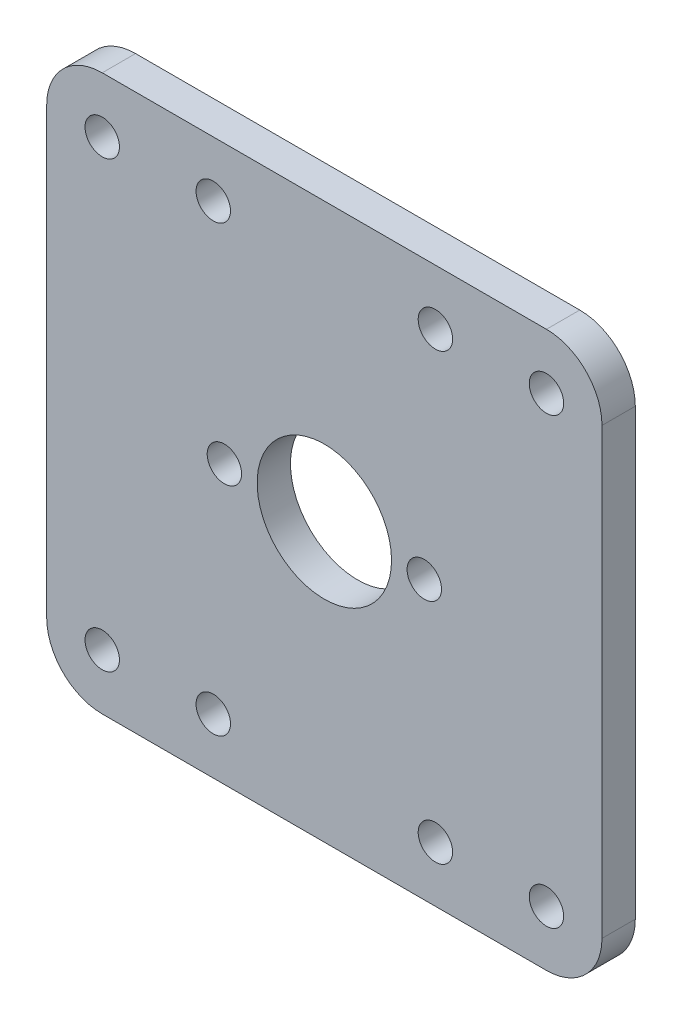
ISO-10303-21;
HEADER;
FILE_DESCRIPTION(('STEP AP214'),'2;1');
FILE_NAME('part.step','',(''),(''),'','','');
FILE_SCHEMA(('AUTOMOTIVE_DESIGN { 1 0 10303 214 1 1 1 1 }'));
ENDSEC;
DATA;
#1=APPLICATION_CONTEXT('core data for automotive mechanical design processes');
#2=APPLICATION_PROTOCOL_DEFINITION('international standard','automotive_design',2000,#1);
#3=PRODUCT_CONTEXT('',#1,'mechanical');
#4=PRODUCT('Part','Part','',(#3));
#5=PRODUCT_RELATED_PRODUCT_CATEGORY('part','',(#4));
#6=PRODUCT_DEFINITION_FORMATION('','',#4);
#7=PRODUCT_DEFINITION_CONTEXT('part definition',#1,'design');
#8=PRODUCT_DEFINITION('design','',#6,#7);
#9=PRODUCT_DEFINITION_SHAPE('','',#8);
#10=(LENGTH_UNIT() NAMED_UNIT(*) SI_UNIT(.MILLI.,.METRE.));
#11=(NAMED_UNIT(*) PLANE_ANGLE_UNIT() SI_UNIT($,.RADIAN.));
#12=(NAMED_UNIT(*) SI_UNIT($,.STERADIAN.) SOLID_ANGLE_UNIT());
#13=UNCERTAINTY_MEASURE_WITH_UNIT(LENGTH_MEASURE(1.E-05),#10,'distance_accuracy_value','');
#14=(GEOMETRIC_REPRESENTATION_CONTEXT(3) GLOBAL_UNCERTAINTY_ASSIGNED_CONTEXT((#13)) GLOBAL_UNIT_ASSIGNED_CONTEXT((#10,
#11,#12)) REPRESENTATION_CONTEXT('',''));
#15=CARTESIAN_POINT('',(0.,0.,0.));
#16=DIRECTION('',(0.,0.,1.));
#17=DIRECTION('',(1.,0.,0.));
#18=AXIS2_PLACEMENT_3D('',#15,#16,#17);
#19=CARTESIAN_POINT('',(0.,0.,3.));
#20=DIRECTION('',(0.,0.,1.));
#21=DIRECTION('',(1.,0.,0.));
#22=AXIS2_PLACEMENT_3D('',#19,#20,#21);
#23=PLANE('',#22);
#24=CARTESIAN_POINT('',(-10.,-20.,3.));
#25=DIRECTION('',(0.,0.,1.));
#26=DIRECTION('',(-1.,0.,0.));
#27=AXIS2_PLACEMENT_3D('',#24,#25,#26);
#28=CIRCLE('',#27,1.55);
#29=CARTESIAN_POINT('',(-11.55,-20.,3.));
#30=VERTEX_POINT('',#29);
#31=EDGE_CURVE('E295',#30,#30,#28,.T.);
#32=ORIENTED_EDGE('',*,*,#31,.F.);
#33=EDGE_LOOP('',(#32));
#34=FACE_BOUND('',#33,.T.);
#35=CARTESIAN_POINT('',(9.99999999999999,-20.,3.));
#36=DIRECTION('',(0.,0.,1.));
#37=DIRECTION('',(1.,0.,0.));
#38=AXIS2_PLACEMENT_3D('',#35,#36,#37);
#39=CIRCLE('',#38,1.55);
#40=CARTESIAN_POINT('',(11.55,-20.,3.));
#41=VERTEX_POINT('',#40);
#42=EDGE_CURVE('E285',#41,#41,#39,.T.);
#43=ORIENTED_EDGE('',*,*,#42,.F.);
#44=EDGE_LOOP('',(#43));
#45=FACE_BOUND('',#44,.T.);
#46=CARTESIAN_POINT('',(9.99999999999999,20.,3.));
#47=DIRECTION('',(0.,0.,1.));
#48=DIRECTION('',(-1.,0.,0.));
#49=AXIS2_PLACEMENT_3D('',#46,#47,#48);
#50=CIRCLE('',#49,1.55);
#51=CARTESIAN_POINT('',(8.44999999999999,20.,3.));
#52=VERTEX_POINT('',#51);
#53=EDGE_CURVE('E275',#52,#52,#50,.T.);
#54=ORIENTED_EDGE('',*,*,#53,.F.);
#55=EDGE_LOOP('',(#54));
#56=FACE_BOUND('',#55,.T.);
#57=CARTESIAN_POINT('',(-10.,20.,3.));
#58=DIRECTION('',(0.,0.,1.));
#59=DIRECTION('',(1.,0.,0.));
#60=AXIS2_PLACEMENT_3D('',#57,#58,#59);
#61=CIRCLE('',#60,1.55);
#62=CARTESIAN_POINT('',(-8.45,20.,3.));
#63=VERTEX_POINT('',#62);
#64=EDGE_CURVE('E282',#63,#63,#61,.T.);
#65=ORIENTED_EDGE('',*,*,#64,.F.);
#66=EDGE_LOOP('',(#65));
#67=FACE_BOUND('',#66,.T.);
#68=CARTESIAN_POINT('',(0.,0.,3.));
#69=DIRECTION('',(0.,0.,1.));
#70=DIRECTION('',(1.,0.,0.));
#71=AXIS2_PLACEMENT_3D('',#68,#69,#70);
#72=CIRCLE('',#71,6.05);
#73=CARTESIAN_POINT('',(6.05,0.,3.));
#74=VERTEX_POINT('',#73);
#75=EDGE_CURVE('E315',#74,#74,#72,.T.);
#76=ORIENTED_EDGE('',*,*,#75,.F.);
#77=EDGE_LOOP('',(#76));
#78=FACE_BOUND('',#77,.T.);
#79=CARTESIAN_POINT('',(20.,-20.,3.));
#80=DIRECTION('',(0.,0.,1.));
#81=DIRECTION('',(1.,0.,0.));
#82=AXIS2_PLACEMENT_3D('',#79,#80,#81);
#83=CIRCLE('',#82,1.55);
#84=CARTESIAN_POINT('',(21.55,-20.,3.));
#85=VERTEX_POINT('',#84);
#86=EDGE_CURVE('E331',#85,#85,#83,.T.);
#87=ORIENTED_EDGE('',*,*,#86,.F.);
#88=EDGE_LOOP('',(#87));
#89=FACE_BOUND('',#88,.T.);
#90=CARTESIAN_POINT('',(-9.,0.,3.));
#91=DIRECTION('',(0.,0.,1.));
#92=DIRECTION('',(1.,0.,0.));
#93=AXIS2_PLACEMENT_3D('',#90,#91,#92);
#94=CIRCLE('',#93,1.55);
#95=CARTESIAN_POINT('',(-7.45,0.,3.));
#96=VERTEX_POINT('',#95);
#97=EDGE_CURVE('E347',#96,#96,#94,.T.);
#98=ORIENTED_EDGE('',*,*,#97,.F.);
#99=EDGE_LOOP('',(#98));
#100=FACE_BOUND('',#99,.T.);
#101=DIRECTION('',(0.,-1.,0.));
#102=VECTOR('',#101,1.);
#103=CARTESIAN_POINT('',(-25.,25.,3.));
#104=LINE('',#103,#102);
#105=CARTESIAN_POINT('',(-25.,20.,3.));
#106=VERTEX_POINT('',#105);
#107=CARTESIAN_POINT('',(-25.,-20.,3.));
#108=VERTEX_POINT('',#107);
#109=EDGE_CURVE('E180',#106,#108,#104,.T.);
#110=ORIENTED_EDGE('',*,*,#109,.T.);
#111=CARTESIAN_POINT('',(-20.,-20.,3.));
#112=DIRECTION('',(0.,0.,1.));
#113=DIRECTION('',(1.,0.,0.));
#114=AXIS2_PLACEMENT_3D('',#111,#112,#113);
#115=CIRCLE('',#114,5.);
#116=CARTESIAN_POINT('',(-20.,-25.,3.));
#117=VERTEX_POINT('',#116);
#118=EDGE_CURVE('E168',#108,#117,#115,.T.);
#119=ORIENTED_EDGE('',*,*,#118,.T.);
#120=DIRECTION('',(1.,0.,0.));
#121=VECTOR('',#120,1.);
#122=CARTESIAN_POINT('',(-25.,-25.,3.));
#123=LINE('',#122,#121);
#124=CARTESIAN_POINT('',(20.,-25.,3.));
#125=VERTEX_POINT('',#124);
#126=EDGE_CURVE('E126',#117,#125,#123,.T.);
#127=ORIENTED_EDGE('',*,*,#126,.T.);
#128=CARTESIAN_POINT('',(20.,-20.,3.));
#129=DIRECTION('',(0.,0.,1.));
#130=DIRECTION('',(1.,0.,0.));
#131=AXIS2_PLACEMENT_3D('',#128,#129,#130);
#132=CIRCLE('',#131,5.);
#133=CARTESIAN_POINT('',(25.,-20.,3.));
#134=VERTEX_POINT('',#133);
#135=EDGE_CURVE('E165',#125,#134,#132,.T.);
#136=ORIENTED_EDGE('',*,*,#135,.T.);
#137=DIRECTION('',(0.,1.,0.));
#138=VECTOR('',#137,1.);
#139=CARTESIAN_POINT('',(25.,25.,3.));
#140=LINE('',#139,#138);
#141=CARTESIAN_POINT('',(25.,20.,3.));
#142=VERTEX_POINT('',#141);
#143=EDGE_CURVE('E135',#134,#142,#140,.T.);
#144=ORIENTED_EDGE('',*,*,#143,.T.);
#145=CARTESIAN_POINT('',(20.,20.,3.));
#146=DIRECTION('',(0.,0.,1.));
#147=DIRECTION('',(1.,0.,0.));
#148=AXIS2_PLACEMENT_3D('',#145,#146,#147);
#149=CIRCLE('',#148,5.);
#150=CARTESIAN_POINT('',(20.,25.,3.));
#151=VERTEX_POINT('',#150);
#152=EDGE_CURVE('E60',#142,#151,#149,.T.);
#153=ORIENTED_EDGE('',*,*,#152,.T.);
#154=DIRECTION('',(-1.,0.,0.));
#155=VECTOR('',#154,1.);
#156=CARTESIAN_POINT('',(-25.,25.,3.));
#157=LINE('',#156,#155);
#158=CARTESIAN_POINT('',(-20.,25.,3.));
#159=VERTEX_POINT('',#158);
#160=EDGE_CURVE('E140',#151,#159,#157,.T.);
#161=ORIENTED_EDGE('',*,*,#160,.T.);
#162=CARTESIAN_POINT('',(-20.,20.,3.));
#163=DIRECTION('',(0.,0.,1.));
#164=DIRECTION('',(1.,0.,0.));
#165=AXIS2_PLACEMENT_3D('',#162,#163,#164);
#166=CIRCLE('',#165,5.);
#167=EDGE_CURVE('E160',#159,#106,#166,.T.);
#168=ORIENTED_EDGE('',*,*,#167,.T.);
#169=EDGE_LOOP('',(#110,#119,#127,#136,#144,#153,#161,#168));
#170=FACE_BOUND('',#169,.T.);
#171=CARTESIAN_POINT('',(-20.,20.,3.));
#172=DIRECTION('',(0.,0.,1.));
#173=DIRECTION('',(1.,0.,0.));
#174=AXIS2_PLACEMENT_3D('',#171,#172,#173);
#175=CIRCLE('',#174,1.55);
#176=CARTESIAN_POINT('',(-18.45,20.,3.));
#177=VERTEX_POINT('',#176);
#178=EDGE_CURVE('E192',#177,#177,#175,.T.);
#179=ORIENTED_EDGE('',*,*,#178,.F.);
#180=EDGE_LOOP('',(#179));
#181=FACE_BOUND('',#180,.T.);
#182=CARTESIAN_POINT('',(20.,20.,3.));
#183=DIRECTION('',(0.,0.,1.));
#184=DIRECTION('',(1.,0.,0.));
#185=AXIS2_PLACEMENT_3D('',#182,#183,#184);
#186=CIRCLE('',#185,1.55);
#187=CARTESIAN_POINT('',(21.55,20.,3.));
#188=VERTEX_POINT('',#187);
#189=EDGE_CURVE('E339',#188,#188,#186,.T.);
#190=ORIENTED_EDGE('',*,*,#189,.F.);
#191=EDGE_LOOP('',(#190));
#192=FACE_BOUND('',#191,.T.);
#193=CARTESIAN_POINT('',(-20.,-20.,3.));
#194=DIRECTION('',(0.,0.,1.));
#195=DIRECTION('',(1.,0.,0.));
#196=AXIS2_PLACEMENT_3D('',#193,#194,#195);
#197=CIRCLE('',#196,1.55);
#198=CARTESIAN_POINT('',(-18.45,-20.,3.));
#199=VERTEX_POINT('',#198);
#200=EDGE_CURVE('E323',#199,#199,#197,.T.);
#201=ORIENTED_EDGE('',*,*,#200,.F.);
#202=EDGE_LOOP('',(#201));
#203=FACE_BOUND('',#202,.T.);
#204=CARTESIAN_POINT('',(9.,0.,3.));
#205=DIRECTION('',(0.,0.,1.));
#206=DIRECTION('',(-1.,0.,0.));
#207=AXIS2_PLACEMENT_3D('',#204,#205,#206);
#208=CIRCLE('',#207,1.55);
#209=CARTESIAN_POINT('',(7.45,0.,3.));
#210=VERTEX_POINT('',#209);
#211=EDGE_CURVE('E307',#210,#210,#208,.T.);
#212=ORIENTED_EDGE('',*,*,#211,.F.);
#213=EDGE_LOOP('',(#212));
#214=FACE_BOUND('',#213,.T.);
#215=ADVANCED_FACE('F38',(#34,#45,#56,#67,#78,#89,#100,#170,#181,#192,#203,#214),#23,.T.);
#216=CARTESIAN_POINT('',(0.,0.,0.));
#217=DIRECTION('',(0.,0.,1.));
#218=DIRECTION('',(1.,0.,0.));
#219=AXIS2_PLACEMENT_3D('',#216,#217,#218);
#220=PLANE('',#219);
#221=CARTESIAN_POINT('',(-10.,-20.,0.));
#222=DIRECTION('',(0.,0.,1.));
#223=DIRECTION('',(-1.,0.,0.));
#224=AXIS2_PLACEMENT_3D('',#221,#222,#223);
#225=CIRCLE('',#224,1.55);
#226=CARTESIAN_POINT('',(-11.55,-20.,0.));
#227=VERTEX_POINT('',#226);
#228=EDGE_CURVE('E291',#227,#227,#225,.T.);
#229=ORIENTED_EDGE('',*,*,#228,.T.);
#230=EDGE_LOOP('',(#229));
#231=FACE_BOUND('',#230,.T.);
#232=CARTESIAN_POINT('',(9.99999999999999,-20.,0.));
#233=DIRECTION('',(0.,0.,1.));
#234=DIRECTION('',(1.,0.,0.));
#235=AXIS2_PLACEMENT_3D('',#232,#233,#234);
#236=CIRCLE('',#235,1.55);
#237=CARTESIAN_POINT('',(11.55,-20.,0.));
#238=VERTEX_POINT('',#237);
#239=EDGE_CURVE('E278',#238,#238,#236,.T.);
#240=ORIENTED_EDGE('',*,*,#239,.T.);
#241=EDGE_LOOP('',(#240));
#242=FACE_BOUND('',#241,.T.);
#243=CARTESIAN_POINT('',(9.99999999999999,20.,0.));
#244=DIRECTION('',(0.,0.,1.));
#245=DIRECTION('',(-1.,0.,0.));
#246=AXIS2_PLACEMENT_3D('',#243,#244,#245);
#247=CIRCLE('',#246,1.55);
#248=CARTESIAN_POINT('',(8.44999999999999,20.,0.));
#249=VERTEX_POINT('',#248);
#250=EDGE_CURVE('E272',#249,#249,#247,.T.);
#251=ORIENTED_EDGE('',*,*,#250,.T.);
#252=EDGE_LOOP('',(#251));
#253=FACE_BOUND('',#252,.T.);
#254=CARTESIAN_POINT('',(-10.,20.,0.));
#255=DIRECTION('',(0.,0.,1.));
#256=DIRECTION('',(1.,0.,0.));
#257=AXIS2_PLACEMENT_3D('',#254,#255,#256);
#258=CIRCLE('',#257,1.55);
#259=CARTESIAN_POINT('',(-8.45,20.,0.));
#260=VERTEX_POINT('',#259);
#261=EDGE_CURVE('E299',#260,#260,#258,.T.);
#262=ORIENTED_EDGE('',*,*,#261,.T.);
#263=EDGE_LOOP('',(#262));
#264=FACE_BOUND('',#263,.T.);
#265=DIRECTION('',(1.,0.,0.));
#266=VECTOR('',#265,1.);
#267=CARTESIAN_POINT('',(-25.,-25.,0.));
#268=LINE('',#267,#266);
#269=CARTESIAN_POINT('',(-20.,-25.,0.));
#270=VERTEX_POINT('',#269);
#271=CARTESIAN_POINT('',(20.,-25.,0.));
#272=VERTEX_POINT('',#271);
#273=EDGE_CURVE('E123',#270,#272,#268,.T.);
#274=ORIENTED_EDGE('',*,*,#273,.F.);
#275=CARTESIAN_POINT('',(-20.,-20.,0.));
#276=DIRECTION('',(0.,0.,1.));
#277=DIRECTION('',(1.,0.,0.));
#278=AXIS2_PLACEMENT_3D('',#275,#276,#277);
#279=CIRCLE('',#278,5.);
#280=CARTESIAN_POINT('',(-25.,-20.,0.));
#281=VERTEX_POINT('',#280);
#282=EDGE_CURVE('E105',#270,#281,#279,.F.);
#283=ORIENTED_EDGE('',*,*,#282,.T.);
#284=DIRECTION('',(0.,-1.,0.));
#285=VECTOR('',#284,1.);
#286=CARTESIAN_POINT('',(-25.,25.,0.));
#287=LINE('',#286,#285);
#288=CARTESIAN_POINT('',(-25.,20.,0.));
#289=VERTEX_POINT('',#288);
#290=EDGE_CURVE('E136',#289,#281,#287,.T.);
#291=ORIENTED_EDGE('',*,*,#290,.F.);
#292=CARTESIAN_POINT('',(-20.,20.,0.));
#293=DIRECTION('',(0.,0.,1.));
#294=DIRECTION('',(1.,0.,0.));
#295=AXIS2_PLACEMENT_3D('',#292,#293,#294);
#296=CIRCLE('',#295,5.);
#297=CARTESIAN_POINT('',(-20.,25.,0.));
#298=VERTEX_POINT('',#297);
#299=EDGE_CURVE('E128',#289,#298,#296,.F.);
#300=ORIENTED_EDGE('',*,*,#299,.T.);
#301=DIRECTION('',(-1.,0.,0.));
#302=VECTOR('',#301,1.);
#303=CARTESIAN_POINT('',(-25.,25.,0.));
#304=LINE('',#303,#302);
#305=CARTESIAN_POINT('',(20.,25.,0.));
#306=VERTEX_POINT('',#305);
#307=EDGE_CURVE('E142',#306,#298,#304,.T.);
#308=ORIENTED_EDGE('',*,*,#307,.F.);
#309=CARTESIAN_POINT('',(20.,20.,0.));
#310=DIRECTION('',(0.,0.,1.));
#311=DIRECTION('',(1.,0.,0.));
#312=AXIS2_PLACEMENT_3D('',#309,#310,#311);
#313=CIRCLE('',#312,5.);
#314=CARTESIAN_POINT('',(25.,20.,0.));
#315=VERTEX_POINT('',#314);
#316=EDGE_CURVE('E150',#306,#315,#313,.F.);
#317=ORIENTED_EDGE('',*,*,#316,.T.);
#318=DIRECTION('',(0.,1.,0.));
#319=VECTOR('',#318,1.);
#320=CARTESIAN_POINT('',(25.,25.,0.));
#321=LINE('',#320,#319);
#322=CARTESIAN_POINT('',(25.,-20.,0.));
#323=VERTEX_POINT('',#322);
#324=EDGE_CURVE('E189',#323,#315,#321,.T.);
#325=ORIENTED_EDGE('',*,*,#324,.F.);
#326=CARTESIAN_POINT('',(20.,-20.,0.));
#327=DIRECTION('',(0.,0.,1.));
#328=DIRECTION('',(1.,0.,0.));
#329=AXIS2_PLACEMENT_3D('',#326,#327,#328);
#330=CIRCLE('',#329,5.);
#331=EDGE_CURVE('E117',#323,#272,#330,.F.);
#332=ORIENTED_EDGE('',*,*,#331,.T.);
#333=EDGE_LOOP('',(#274,#283,#291,#300,#308,#317,#325,#332));
#334=FACE_BOUND('',#333,.T.);
#335=CARTESIAN_POINT('',(-20.,20.,0.));
#336=DIRECTION('',(0.,0.,1.));
#337=DIRECTION('',(1.,0.,0.));
#338=AXIS2_PLACEMENT_3D('',#335,#336,#337);
#339=CIRCLE('',#338,1.55);
#340=CARTESIAN_POINT('',(-18.45,20.,0.));
#341=VERTEX_POINT('',#340);
#342=EDGE_CURVE('E351',#341,#341,#339,.T.);
#343=ORIENTED_EDGE('',*,*,#342,.T.);
#344=EDGE_LOOP('',(#343));
#345=FACE_BOUND('',#344,.T.);
#346=CARTESIAN_POINT('',(-9.,0.,0.));
#347=DIRECTION('',(0.,0.,1.));
#348=DIRECTION('',(1.,0.,0.));
#349=AXIS2_PLACEMENT_3D('',#346,#347,#348);
#350=CIRCLE('',#349,1.55);
#351=CARTESIAN_POINT('',(-7.45,0.,0.));
#352=VERTEX_POINT('',#351);
#353=EDGE_CURVE('E343',#352,#352,#350,.T.);
#354=ORIENTED_EDGE('',*,*,#353,.T.);
#355=EDGE_LOOP('',(#354));
#356=FACE_BOUND('',#355,.T.);
#357=CARTESIAN_POINT('',(20.,20.,0.));
#358=DIRECTION('',(0.,0.,1.));
#359=DIRECTION('',(1.,0.,0.));
#360=AXIS2_PLACEMENT_3D('',#357,#358,#359);
#361=CIRCLE('',#360,1.55);
#362=CARTESIAN_POINT('',(21.55,20.,0.));
#363=VERTEX_POINT('',#362);
#364=EDGE_CURVE('E335',#363,#363,#361,.T.);
#365=ORIENTED_EDGE('',*,*,#364,.T.);
#366=EDGE_LOOP('',(#365));
#367=FACE_BOUND('',#366,.T.);
#368=CARTESIAN_POINT('',(20.,-20.,0.));
#369=DIRECTION('',(0.,0.,1.));
#370=DIRECTION('',(1.,0.,0.));
#371=AXIS2_PLACEMENT_3D('',#368,#369,#370);
#372=CIRCLE('',#371,1.55);
#373=CARTESIAN_POINT('',(21.55,-20.,0.));
#374=VERTEX_POINT('',#373);
#375=EDGE_CURVE('E327',#374,#374,#372,.T.);
#376=ORIENTED_EDGE('',*,*,#375,.T.);
#377=EDGE_LOOP('',(#376));
#378=FACE_BOUND('',#377,.T.);
#379=CARTESIAN_POINT('',(-20.,-20.,0.));
#380=DIRECTION('',(0.,0.,1.));
#381=DIRECTION('',(1.,0.,0.));
#382=AXIS2_PLACEMENT_3D('',#379,#380,#381);
#383=CIRCLE('',#382,1.55);
#384=CARTESIAN_POINT('',(-18.45,-20.,0.));
#385=VERTEX_POINT('',#384);
#386=EDGE_CURVE('E319',#385,#385,#383,.T.);
#387=ORIENTED_EDGE('',*,*,#386,.T.);
#388=EDGE_LOOP('',(#387));
#389=FACE_BOUND('',#388,.T.);
#390=CARTESIAN_POINT('',(0.,0.,0.));
#391=DIRECTION('',(0.,0.,1.));
#392=DIRECTION('',(1.,0.,0.));
#393=AXIS2_PLACEMENT_3D('',#390,#391,#392);
#394=CIRCLE('',#393,6.05);
#395=CARTESIAN_POINT('',(6.05,0.,0.));
#396=VERTEX_POINT('',#395);
#397=EDGE_CURVE('E311',#396,#396,#394,.T.);
#398=ORIENTED_EDGE('',*,*,#397,.T.);
#399=EDGE_LOOP('',(#398));
#400=FACE_BOUND('',#399,.T.);
#401=CARTESIAN_POINT('',(9.,0.,0.));
#402=DIRECTION('',(0.,0.,1.));
#403=DIRECTION('',(-1.,0.,0.));
#404=AXIS2_PLACEMENT_3D('',#401,#402,#403);
#405=CIRCLE('',#404,1.55);
#406=CARTESIAN_POINT('',(7.45,0.,0.));
#407=VERTEX_POINT('',#406);
#408=EDGE_CURVE('E303',#407,#407,#405,.T.);
#409=ORIENTED_EDGE('',*,*,#408,.T.);
#410=EDGE_LOOP('',(#409));
#411=FACE_BOUND('',#410,.T.);
#412=ADVANCED_FACE('F131',(#231,#242,#253,#264,#334,#345,#356,#367,#378,#389,#400,#411),#220,.F.);
#413=CARTESIAN_POINT('',(25.,25.,3.));
#414=DIRECTION('',(-1.,0.,0.));
#415=DIRECTION('',(0.,-1.,0.));
#416=AXIS2_PLACEMENT_3D('',#413,#414,#415);
#417=PLANE('',#416);
#418=ORIENTED_EDGE('',*,*,#143,.F.);
#419=DIRECTION('',(0.,0.,-1.));
#420=VECTOR('',#419,1.);
#421=CARTESIAN_POINT('',(25.,-20.,3.));
#422=LINE('',#421,#420);
#423=EDGE_CURVE('E174',#134,#323,#422,.T.);
#424=ORIENTED_EDGE('',*,*,#423,.T.);
#425=ORIENTED_EDGE('',*,*,#324,.T.);
#426=DIRECTION('',(0.,0.,-1.));
#427=VECTOR('',#426,1.);
#428=CARTESIAN_POINT('',(25.,20.,3.));
#429=LINE('',#428,#427);
#430=EDGE_CURVE('E171',#315,#142,#429,.F.);
#431=ORIENTED_EDGE('',*,*,#430,.T.);
#432=EDGE_LOOP('',(#418,#424,#425,#431));
#433=FACE_BOUND('',#432,.T.);
#434=ADVANCED_FACE('F211',(#433),#417,.F.);
#435=CARTESIAN_POINT('',(-25.,25.,3.));
#436=DIRECTION('',(0.,-1.,0.));
#437=DIRECTION('',(0.,0.,-1.));
#438=AXIS2_PLACEMENT_3D('',#435,#436,#437);
#439=PLANE('',#438);
#440=ORIENTED_EDGE('',*,*,#160,.F.);
#441=DIRECTION('',(0.,0.,-1.));
#442=VECTOR('',#441,1.);
#443=CARTESIAN_POINT('',(20.,25.,3.));
#444=LINE('',#443,#442);
#445=EDGE_CURVE('E11',#151,#306,#444,.T.);
#446=ORIENTED_EDGE('',*,*,#445,.T.);
#447=ORIENTED_EDGE('',*,*,#307,.T.);
#448=DIRECTION('',(0.,0.,-1.));
#449=VECTOR('',#448,1.);
#450=CARTESIAN_POINT('',(-20.,25.,3.));
#451=LINE('',#450,#449);
#452=EDGE_CURVE('E47',#298,#159,#451,.F.);
#453=ORIENTED_EDGE('',*,*,#452,.T.);
#454=EDGE_LOOP('',(#440,#446,#447,#453));
#455=FACE_BOUND('',#454,.T.);
#456=ADVANCED_FACE('F195',(#455),#439,.F.);
#457=CARTESIAN_POINT('',(-25.,25.,3.));
#458=DIRECTION('',(1.,0.,0.));
#459=DIRECTION('',(0.,1.,0.));
#460=AXIS2_PLACEMENT_3D('',#457,#458,#459);
#461=PLANE('',#460);
#462=ORIENTED_EDGE('',*,*,#290,.T.);
#463=DIRECTION('',(0.,0.,-1.));
#464=VECTOR('',#463,1.);
#465=CARTESIAN_POINT('',(-25.,-20.,3.));
#466=LINE('',#465,#464);
#467=EDGE_CURVE('E110',#281,#108,#466,.F.);
#468=ORIENTED_EDGE('',*,*,#467,.T.);
#469=ORIENTED_EDGE('',*,*,#109,.F.);
#470=DIRECTION('',(0.,0.,-1.));
#471=VECTOR('',#470,1.);
#472=CARTESIAN_POINT('',(-25.,20.,3.));
#473=LINE('',#472,#471);
#474=EDGE_CURVE('E116',#106,#289,#473,.T.);
#475=ORIENTED_EDGE('',*,*,#474,.T.);
#476=EDGE_LOOP('',(#462,#468,#469,#475));
#477=FACE_BOUND('',#476,.T.);
#478=ADVANCED_FACE('F202',(#477),#461,.F.);
#479=CARTESIAN_POINT('',(-25.,-25.,3.));
#480=DIRECTION('',(0.,1.,0.));
#481=DIRECTION('',(0.,0.,1.));
#482=AXIS2_PLACEMENT_3D('',#479,#480,#481);
#483=PLANE('',#482);
#484=ORIENTED_EDGE('',*,*,#126,.F.);
#485=DIRECTION('',(0.,0.,-1.));
#486=VECTOR('',#485,1.);
#487=CARTESIAN_POINT('',(-20.,-25.,3.));
#488=LINE('',#487,#486);
#489=EDGE_CURVE('E109',#117,#270,#488,.T.);
#490=ORIENTED_EDGE('',*,*,#489,.T.);
#491=ORIENTED_EDGE('',*,*,#273,.T.);
#492=DIRECTION('',(0.,0.,-1.));
#493=VECTOR('',#492,1.);
#494=CARTESIAN_POINT('',(20.,-25.,3.));
#495=LINE('',#494,#493);
#496=EDGE_CURVE('E129',#272,#125,#495,.F.);
#497=ORIENTED_EDGE('',*,*,#496,.T.);
#498=EDGE_LOOP('',(#484,#490,#491,#497));
#499=FACE_BOUND('',#498,.T.);
#500=ADVANCED_FACE('F122',(#499),#483,.F.);
#501=CARTESIAN_POINT('',(-20.,20.,3.));
#502=DIRECTION('',(0.,0.,-1.));
#503=DIRECTION('',(-1.,0.,0.));
#504=AXIS2_PLACEMENT_3D('',#501,#502,#503);
#505=CYLINDRICAL_SURFACE('',#504,1.55);
#506=ORIENTED_EDGE('',*,*,#178,.T.);
#507=EDGE_LOOP('',(#506));
#508=FACE_BOUND('',#507,.T.);
#509=ORIENTED_EDGE('',*,*,#342,.F.);
#510=EDGE_LOOP('',(#509));
#511=FACE_BOUND('',#510,.T.);
#512=ADVANCED_FACE('F209',(#508,#511),#505,.F.);
#513=CARTESIAN_POINT('',(-9.,0.,3.));
#514=DIRECTION('',(0.,0.,-1.));
#515=DIRECTION('',(-1.,0.,0.));
#516=AXIS2_PLACEMENT_3D('',#513,#514,#515);
#517=CYLINDRICAL_SURFACE('',#516,1.55);
#518=ORIENTED_EDGE('',*,*,#97,.T.);
#519=EDGE_LOOP('',(#518));
#520=FACE_BOUND('',#519,.T.);
#521=ORIENTED_EDGE('',*,*,#353,.F.);
#522=EDGE_LOOP('',(#521));
#523=FACE_BOUND('',#522,.T.);
#524=ADVANCED_FACE('F227',(#520,#523),#517,.F.);
#525=CARTESIAN_POINT('',(20.,20.,3.));
#526=DIRECTION('',(0.,0.,-1.));
#527=DIRECTION('',(-1.,0.,0.));
#528=AXIS2_PLACEMENT_3D('',#525,#526,#527);
#529=CYLINDRICAL_SURFACE('',#528,1.55);
#530=ORIENTED_EDGE('',*,*,#189,.T.);
#531=EDGE_LOOP('',(#530));
#532=FACE_BOUND('',#531,.T.);
#533=ORIENTED_EDGE('',*,*,#364,.F.);
#534=EDGE_LOOP('',(#533));
#535=FACE_BOUND('',#534,.T.);
#536=ADVANCED_FACE('F231',(#532,#535),#529,.F.);
#537=CARTESIAN_POINT('',(20.,-20.,3.));
#538=DIRECTION('',(0.,0.,-1.));
#539=DIRECTION('',(-1.,0.,0.));
#540=AXIS2_PLACEMENT_3D('',#537,#538,#539);
#541=CYLINDRICAL_SURFACE('',#540,1.55);
#542=ORIENTED_EDGE('',*,*,#86,.T.);
#543=EDGE_LOOP('',(#542));
#544=FACE_BOUND('',#543,.T.);
#545=ORIENTED_EDGE('',*,*,#375,.F.);
#546=EDGE_LOOP('',(#545));
#547=FACE_BOUND('',#546,.T.);
#548=ADVANCED_FACE('F235',(#544,#547),#541,.F.);
#549=CARTESIAN_POINT('',(-20.,-20.,3.));
#550=DIRECTION('',(0.,0.,-1.));
#551=DIRECTION('',(-1.,0.,0.));
#552=AXIS2_PLACEMENT_3D('',#549,#550,#551);
#553=CYLINDRICAL_SURFACE('',#552,1.55);
#554=ORIENTED_EDGE('',*,*,#200,.T.);
#555=EDGE_LOOP('',(#554));
#556=FACE_BOUND('',#555,.T.);
#557=ORIENTED_EDGE('',*,*,#386,.F.);
#558=EDGE_LOOP('',(#557));
#559=FACE_BOUND('',#558,.T.);
#560=ADVANCED_FACE('F239',(#556,#559),#553,.F.);
#561=CARTESIAN_POINT('',(0.,0.,3.));
#562=DIRECTION('',(0.,0.,-1.));
#563=DIRECTION('',(-1.,0.,0.));
#564=AXIS2_PLACEMENT_3D('',#561,#562,#563);
#565=CYLINDRICAL_SURFACE('',#564,6.05);
#566=ORIENTED_EDGE('',*,*,#75,.T.);
#567=EDGE_LOOP('',(#566));
#568=FACE_BOUND('',#567,.T.);
#569=ORIENTED_EDGE('',*,*,#397,.F.);
#570=EDGE_LOOP('',(#569));
#571=FACE_BOUND('',#570,.T.);
#572=ADVANCED_FACE('F243',(#568,#571),#565,.F.);
#573=CARTESIAN_POINT('',(9.,0.,3.));
#574=DIRECTION('',(0.,0.,-1.));
#575=DIRECTION('',(-1.,0.,0.));
#576=AXIS2_PLACEMENT_3D('',#573,#574,#575);
#577=CYLINDRICAL_SURFACE('',#576,1.55);
#578=ORIENTED_EDGE('',*,*,#211,.T.);
#579=EDGE_LOOP('',(#578));
#580=FACE_BOUND('',#579,.T.);
#581=ORIENTED_EDGE('',*,*,#408,.F.);
#582=EDGE_LOOP('',(#581));
#583=FACE_BOUND('',#582,.T.);
#584=ADVANCED_FACE('F247',(#580,#583),#577,.F.);
#585=CARTESIAN_POINT('',(-20.,-20.,3.));
#586=DIRECTION('',(0.,0.,-1.));
#587=DIRECTION('',(-1.,0.,0.));
#588=AXIS2_PLACEMENT_3D('',#585,#586,#587);
#589=CYLINDRICAL_SURFACE('',#588,5.);
#590=ORIENTED_EDGE('',*,*,#118,.F.);
#591=ORIENTED_EDGE('',*,*,#467,.F.);
#592=ORIENTED_EDGE('',*,*,#282,.F.);
#593=ORIENTED_EDGE('',*,*,#489,.F.);
#594=EDGE_LOOP('',(#590,#591,#592,#593));
#595=FACE_BOUND('',#594,.T.);
#596=ADVANCED_FACE('F108',(#595),#589,.T.);
#597=CARTESIAN_POINT('',(20.,-20.,3.));
#598=DIRECTION('',(0.,0.,-1.));
#599=DIRECTION('',(-1.,0.,0.));
#600=AXIS2_PLACEMENT_3D('',#597,#598,#599);
#601=CYLINDRICAL_SURFACE('',#600,5.);
#602=ORIENTED_EDGE('',*,*,#135,.F.);
#603=ORIENTED_EDGE('',*,*,#496,.F.);
#604=ORIENTED_EDGE('',*,*,#331,.F.);
#605=ORIENTED_EDGE('',*,*,#423,.F.);
#606=EDGE_LOOP('',(#602,#603,#604,#605));
#607=FACE_BOUND('',#606,.T.);
#608=ADVANCED_FACE('F438',(#607),#601,.T.);
#609=CARTESIAN_POINT('',(20.,20.,3.));
#610=DIRECTION('',(0.,0.,-1.));
#611=DIRECTION('',(-1.,0.,0.));
#612=AXIS2_PLACEMENT_3D('',#609,#610,#611);
#613=CYLINDRICAL_SURFACE('',#612,5.);
#614=ORIENTED_EDGE('',*,*,#152,.F.);
#615=ORIENTED_EDGE('',*,*,#430,.F.);
#616=ORIENTED_EDGE('',*,*,#316,.F.);
#617=ORIENTED_EDGE('',*,*,#445,.F.);
#618=EDGE_LOOP('',(#614,#615,#616,#617));
#619=FACE_BOUND('',#618,.T.);
#620=ADVANCED_FACE('F431',(#619),#613,.T.);
#621=CARTESIAN_POINT('',(-20.,20.,3.));
#622=DIRECTION('',(0.,0.,-1.));
#623=DIRECTION('',(-1.,0.,0.));
#624=AXIS2_PLACEMENT_3D('',#621,#622,#623);
#625=CYLINDRICAL_SURFACE('',#624,5.);
#626=ORIENTED_EDGE('',*,*,#167,.F.);
#627=ORIENTED_EDGE('',*,*,#452,.F.);
#628=ORIENTED_EDGE('',*,*,#299,.F.);
#629=ORIENTED_EDGE('',*,*,#474,.F.);
#630=EDGE_LOOP('',(#626,#627,#628,#629));
#631=FACE_BOUND('',#630,.T.);
#632=ADVANCED_FACE('F40',(#631),#625,.T.);
#633=CARTESIAN_POINT('',(-10.,20.,0.));
#634=DIRECTION('',(0.,0.,1.));
#635=DIRECTION('',(1.,0.,0.));
#636=AXIS2_PLACEMENT_3D('',#633,#634,#635);
#637=CYLINDRICAL_SURFACE('',#636,1.55);
#638=ORIENTED_EDGE('',*,*,#261,.F.);
#639=EDGE_LOOP('',(#638));
#640=FACE_BOUND('',#639,.T.);
#641=ORIENTED_EDGE('',*,*,#64,.T.);
#642=EDGE_LOOP('',(#641));
#643=FACE_BOUND('',#642,.T.);
#644=ADVANCED_FACE('F252',(#640,#643),#637,.F.);
#645=CARTESIAN_POINT('',(9.99999999999999,20.,0.));
#646=DIRECTION('',(0.,0.,1.));
#647=DIRECTION('',(1.,0.,0.));
#648=AXIS2_PLACEMENT_3D('',#645,#646,#647);
#649=CYLINDRICAL_SURFACE('',#648,1.55);
#650=ORIENTED_EDGE('',*,*,#250,.F.);
#651=EDGE_LOOP('',(#650));
#652=FACE_BOUND('',#651,.T.);
#653=ORIENTED_EDGE('',*,*,#53,.T.);
#654=EDGE_LOOP('',(#653));
#655=FACE_BOUND('',#654,.T.);
#656=ADVANCED_FACE('F255',(#652,#655),#649,.F.);
#657=CARTESIAN_POINT('',(9.99999999999999,-20.,0.));
#658=DIRECTION('',(0.,0.,1.));
#659=DIRECTION('',(1.,0.,0.));
#660=AXIS2_PLACEMENT_3D('',#657,#658,#659);
#661=CYLINDRICAL_SURFACE('',#660,1.55);
#662=ORIENTED_EDGE('',*,*,#239,.F.);
#663=EDGE_LOOP('',(#662));
#664=FACE_BOUND('',#663,.T.);
#665=ORIENTED_EDGE('',*,*,#42,.T.);
#666=EDGE_LOOP('',(#665));
#667=FACE_BOUND('',#666,.T.);
#668=ADVANCED_FACE('F260',(#664,#667),#661,.F.);
#669=CARTESIAN_POINT('',(-10.,-20.,0.));
#670=DIRECTION('',(0.,0.,1.));
#671=DIRECTION('',(1.,0.,0.));
#672=AXIS2_PLACEMENT_3D('',#669,#670,#671);
#673=CYLINDRICAL_SURFACE('',#672,1.55);
#674=ORIENTED_EDGE('',*,*,#228,.F.);
#675=EDGE_LOOP('',(#674));
#676=FACE_BOUND('',#675,.T.);
#677=ORIENTED_EDGE('',*,*,#31,.T.);
#678=EDGE_LOOP('',(#677));
#679=FACE_BOUND('',#678,.T.);
#680=ADVANCED_FACE('F257',(#676,#679),#673,.F.);
#681=CLOSED_SHELL('',(#215,#412,#434,#456,#478,#500,#512,#524,#536,#548,#560,#572,#584,#596,
#608,#620,#632,#644,#656,#668,#680));
#682=MANIFOLD_SOLID_BREP('B2',#681);
#683=ADVANCED_BREP_SHAPE_REPRESENTATION('',(#18,#682),#14);
#684=SHAPE_DEFINITION_REPRESENTATION(#9,#683);
ENDSEC;
END-ISO-10303-21;
